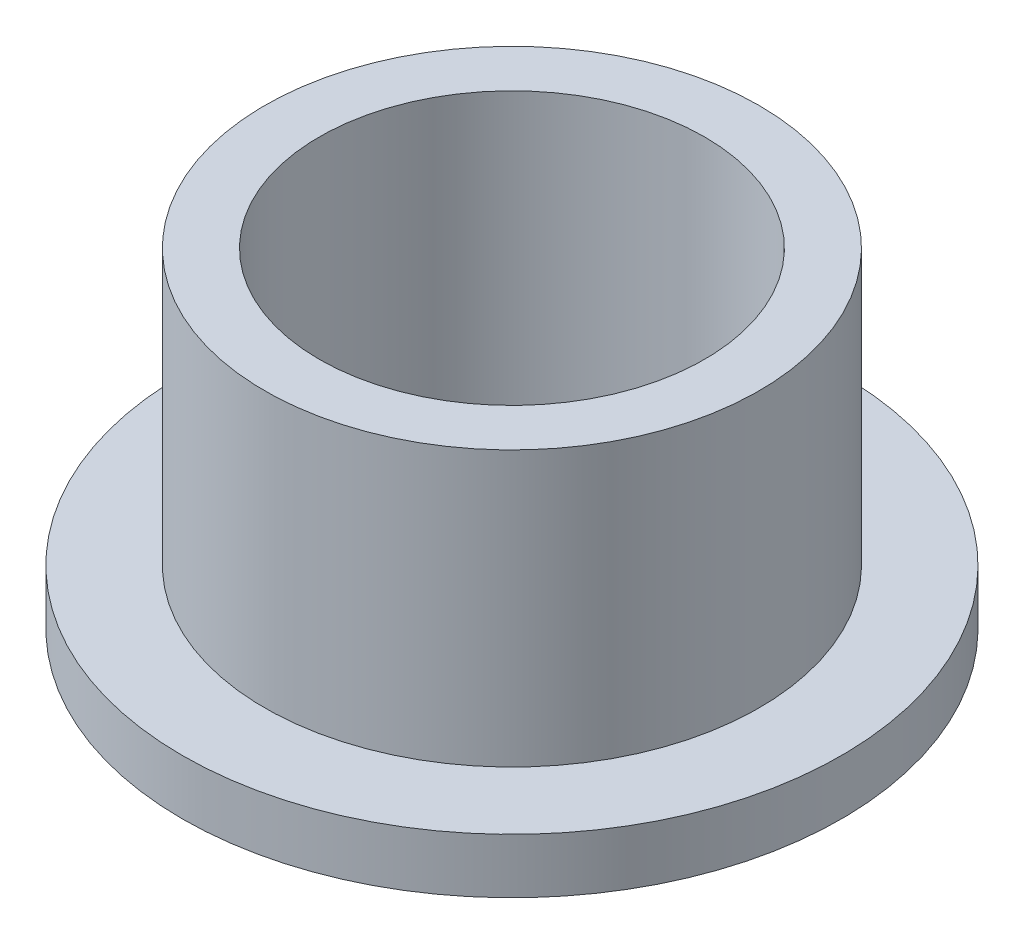
ISO-10303-21;
HEADER;
FILE_DESCRIPTION(('STEP AP214'),'2;1');
FILE_NAME('part.step','',(''),(''),'','','');
FILE_SCHEMA(('AUTOMOTIVE_DESIGN { 1 0 10303 214 1 1 1 1 }'));
ENDSEC;
DATA;
#1=APPLICATION_CONTEXT('core data for automotive mechanical design processes');
#2=APPLICATION_PROTOCOL_DEFINITION('international standard','automotive_design',2000,#1);
#3=PRODUCT_CONTEXT('',#1,'mechanical');
#4=PRODUCT('Part','Part','',(#3));
#5=PRODUCT_RELATED_PRODUCT_CATEGORY('part','',(#4));
#6=PRODUCT_DEFINITION_FORMATION('','',#4);
#7=PRODUCT_DEFINITION_CONTEXT('part definition',#1,'design');
#8=PRODUCT_DEFINITION('design','',#6,#7);
#9=PRODUCT_DEFINITION_SHAPE('','',#8);
#10=(LENGTH_UNIT() NAMED_UNIT(*) SI_UNIT(.MILLI.,.METRE.));
#11=(NAMED_UNIT(*) PLANE_ANGLE_UNIT() SI_UNIT($,.RADIAN.));
#12=(NAMED_UNIT(*) SI_UNIT($,.STERADIAN.) SOLID_ANGLE_UNIT());
#13=UNCERTAINTY_MEASURE_WITH_UNIT(LENGTH_MEASURE(1.E-05),#10,'distance_accuracy_value','');
#14=(GEOMETRIC_REPRESENTATION_CONTEXT(3) GLOBAL_UNCERTAINTY_ASSIGNED_CONTEXT((#13)) GLOBAL_UNIT_ASSIGNED_CONTEXT((#10,
#11,#12)) REPRESENTATION_CONTEXT('',''));
#15=CARTESIAN_POINT('',(0.,0.,0.));
#16=DIRECTION('',(0.,0.,1.));
#17=DIRECTION('',(1.,0.,0.));
#18=AXIS2_PLACEMENT_3D('',#15,#16,#17);
#19=CARTESIAN_POINT('',(0.,19.05,0.));
#20=DIRECTION('',(0.,1.,0.));
#21=DIRECTION('',(0.,0.,1.));
#22=AXIS2_PLACEMENT_3D('',#19,#20,#21);
#23=PLANE('',#22);
#24=CARTESIAN_POINT('',(0.,19.05,0.));
#25=DIRECTION('',(0.,1.,0.));
#26=DIRECTION('',(0.,0.,1.));
#27=AXIS2_PLACEMENT_3D('',#24,#25,#26);
#28=CIRCLE('',#27,14.2875);
#29=CARTESIAN_POINT('',(0.,19.05,-14.2875));
#30=VERTEX_POINT('',#29);
#31=EDGE_CURVE('E10',#30,#30,#28,.T.);
#32=ORIENTED_EDGE('',*,*,#31,.T.);
#33=EDGE_LOOP('',(#32));
#34=FACE_BOUND('',#33,.T.);
#35=CARTESIAN_POINT('',(0.,19.05,0.));
#36=DIRECTION('',(0.,1.,0.));
#37=DIRECTION('',(0.,0.,1.));
#38=AXIS2_PLACEMENT_3D('',#35,#36,#37);
#39=CIRCLE('',#38,11.1379);
#40=CARTESIAN_POINT('',(0.,19.05,-11.1379));
#41=VERTEX_POINT('',#40);
#42=EDGE_CURVE('E39',#41,#41,#39,.T.);
#43=ORIENTED_EDGE('',*,*,#42,.F.);
#44=EDGE_LOOP('',(#43));
#45=FACE_BOUND('',#44,.T.);
#46=ADVANCED_FACE('F32',(#34,#45),#23,.T.);
#47=CARTESIAN_POINT('',(0.,0.,0.));
#48=DIRECTION('',(0.,1.,0.));
#49=DIRECTION('',(0.,0.,1.));
#50=AXIS2_PLACEMENT_3D('',#47,#48,#49);
#51=PLANE('',#50);
#52=CARTESIAN_POINT('',(0.,0.,0.));
#53=DIRECTION('',(0.,1.,0.));
#54=DIRECTION('',(0.,0.,1.));
#55=AXIS2_PLACEMENT_3D('',#52,#53,#54);
#56=CIRCLE('',#55,11.1379);
#57=CARTESIAN_POINT('',(0.,0.,-11.1379));
#58=VERTEX_POINT('',#57);
#59=EDGE_CURVE('E43',#58,#58,#56,.T.);
#60=ORIENTED_EDGE('',*,*,#59,.T.);
#61=EDGE_LOOP('',(#60));
#62=FACE_BOUND('',#61,.T.);
#63=CARTESIAN_POINT('',(0.,0.,0.));
#64=DIRECTION('',(0.,1.,0.));
#65=DIRECTION('',(0.,0.,1.));
#66=AXIS2_PLACEMENT_3D('',#63,#64,#65);
#67=CIRCLE('',#66,19.05);
#68=CARTESIAN_POINT('',(0.,0.,19.05));
#69=VERTEX_POINT('',#68);
#70=EDGE_CURVE('E50',#69,#69,#67,.T.);
#71=ORIENTED_EDGE('',*,*,#70,.F.);
#72=EDGE_LOOP('',(#71));
#73=FACE_BOUND('',#72,.T.);
#74=ADVANCED_FACE('F75',(#62,#73),#51,.F.);
#75=CARTESIAN_POINT('',(0.,19.05,0.));
#76=DIRECTION('',(0.,-1.,0.));
#77=DIRECTION('',(0.,0.,-1.));
#78=AXIS2_PLACEMENT_3D('',#75,#76,#77);
#79=CYLINDRICAL_SURFACE('',#78,14.2875);
#80=CARTESIAN_POINT('',(0.,3.175,0.));
#81=DIRECTION('',(0.,1.,0.));
#82=DIRECTION('',(0.,0.,1.));
#83=AXIS2_PLACEMENT_3D('',#80,#81,#82);
#84=CIRCLE('',#83,14.2875);
#85=CARTESIAN_POINT('',(0.,3.175,-14.2875));
#86=VERTEX_POINT('',#85);
#87=EDGE_CURVE('E53',#86,#86,#84,.T.);
#88=CARTESIAN_POINT('',(0.,3.175,-14.2875));
#89=CARTESIAN_POINT('',(0.,3.34036458333333,-14.2875));
#90=CARTESIAN_POINT('',(0.,3.50572916666666,-14.2875));
#91=CARTESIAN_POINT('',(0.,3.83645833333333,-14.2875));
#92=CARTESIAN_POINT('',(0.,4.00182291666666,-14.2875));
#93=CARTESIAN_POINT('',(0.,4.33255208333333,-14.2875));
#94=CARTESIAN_POINT('',(0.,4.49791666666666,-14.2875));
#95=CARTESIAN_POINT('',(0.,4.82864583333333,-14.2875));
#96=CARTESIAN_POINT('',(0.,4.99401041666666,-14.2875));
#97=CARTESIAN_POINT('',(0.,5.32473958333333,-14.2875));
#98=CARTESIAN_POINT('',(0.,5.49010416666666,-14.2875));
#99=CARTESIAN_POINT('',(0.,5.82083333333333,-14.2875));
#100=CARTESIAN_POINT('',(0.,5.98619791666666,-14.2875));
#101=CARTESIAN_POINT('',(0.,6.31692708333333,-14.2875));
#102=CARTESIAN_POINT('',(0.,6.48229166666666,-14.2875));
#103=CARTESIAN_POINT('',(0.,6.81302083333333,-14.2875));
#104=CARTESIAN_POINT('',(0.,6.97838541666666,-14.2875));
#105=CARTESIAN_POINT('',(0.,7.30911458333333,-14.2875));
#106=CARTESIAN_POINT('',(0.,7.47447916666667,-14.2875));
#107=CARTESIAN_POINT('',(0.,7.80520833333333,-14.2875));
#108=CARTESIAN_POINT('',(0.,7.97057291666667,-14.2875));
#109=CARTESIAN_POINT('',(0.,8.30130208333333,-14.2875));
#110=CARTESIAN_POINT('',(0.,8.46666666666666,-14.2875));
#111=CARTESIAN_POINT('',(0.,8.79739583333333,-14.2875));
#112=CARTESIAN_POINT('',(0.,8.96276041666667,-14.2875));
#113=CARTESIAN_POINT('',(0.,9.29348958333333,-14.2875));
#114=CARTESIAN_POINT('',(0.,9.45885416666667,-14.2875));
#115=CARTESIAN_POINT('',(0.,9.78958333333333,-14.2875));
#116=CARTESIAN_POINT('',(0.,9.95494791666667,-14.2875));
#117=CARTESIAN_POINT('',(0.,10.2856770833333,-14.2875));
#118=CARTESIAN_POINT('',(0.,10.4510416666667,-14.2875));
#119=CARTESIAN_POINT('',(0.,10.7817708333333,-14.2875));
#120=CARTESIAN_POINT('',(0.,10.9471354166667,-14.2875));
#121=CARTESIAN_POINT('',(0.,11.2778645833333,-14.2875));
#122=CARTESIAN_POINT('',(0.,11.4432291666667,-14.2875));
#123=CARTESIAN_POINT('',(0.,11.7739583333333,-14.2875));
#124=CARTESIAN_POINT('',(0.,11.9393229166667,-14.2875));
#125=CARTESIAN_POINT('',(0.,12.2700520833333,-14.2875));
#126=CARTESIAN_POINT('',(0.,12.4354166666667,-14.2875));
#127=CARTESIAN_POINT('',(0.,12.7661458333333,-14.2875));
#128=CARTESIAN_POINT('',(0.,12.9315104166667,-14.2875));
#129=CARTESIAN_POINT('',(0.,13.2622395833333,-14.2875));
#130=CARTESIAN_POINT('',(0.,13.4276041666667,-14.2875));
#131=CARTESIAN_POINT('',(0.,13.7583333333333,-14.2875));
#132=CARTESIAN_POINT('',(0.,13.9236979166667,-14.2875));
#133=CARTESIAN_POINT('',(0.,14.2544270833333,-14.2875));
#134=CARTESIAN_POINT('',(0.,14.4197916666667,-14.2875));
#135=CARTESIAN_POINT('',(0.,14.7505208333333,-14.2875));
#136=CARTESIAN_POINT('',(0.,14.9158854166667,-14.2875));
#137=CARTESIAN_POINT('',(0.,15.2466145833333,-14.2875));
#138=CARTESIAN_POINT('',(0.,15.4119791666667,-14.2875));
#139=CARTESIAN_POINT('',(0.,15.7427083333333,-14.2875));
#140=CARTESIAN_POINT('',(0.,15.9080729166667,-14.2875));
#141=CARTESIAN_POINT('',(0.,16.2388020833333,-14.2875));
#142=CARTESIAN_POINT('',(0.,16.4041666666667,-14.2875));
#143=CARTESIAN_POINT('',(0.,16.7348958333333,-14.2875));
#144=CARTESIAN_POINT('',(0.,16.9002604166667,-14.2875));
#145=CARTESIAN_POINT('',(0.,17.2309895833333,-14.2875));
#146=CARTESIAN_POINT('',(0.,17.3963541666667,-14.2875));
#147=CARTESIAN_POINT('',(0.,17.7270833333333,-14.2875));
#148=CARTESIAN_POINT('',(0.,17.8924479166667,-14.2875));
#149=CARTESIAN_POINT('',(0.,18.2231770833333,-14.2875));
#150=CARTESIAN_POINT('',(0.,18.3885416666667,-14.2875));
#151=CARTESIAN_POINT('',(0.,18.7192708333333,-14.2875));
#152=CARTESIAN_POINT('',(0.,18.8846354166667,-14.2875));
#153=CARTESIAN_POINT('',(0.,19.05,-14.2875));
#154=B_SPLINE_CURVE_WITH_KNOTS('',3,(#88,#89,#90,#91,#92,#93,#94,#95,#96,#97,#98,#99,#100,#101,
#102,#103,#104,#105,#106,#107,#108,#109,#110,#111,#112,#113,#114,#115,#116,#117,#118,#119,#120,
#121,#122,#123,#124,#125,#126,#127,#128,#129,#130,#131,#132,#133,#134,#135,#136,#137,#138,#139,
#140,#141,#142,#143,#144,#145,#146,#147,#148,#149,#150,#151,#152,#153),.UNSPECIFIED.,.F.,.F.,(4,
2,2,2,2,2,2,2,2,2,2,2,2,2,2,2,2,2,2,2,2,2,2,2,2,2,2,2,2,2,2,2,4),(0.,0.496093749999999,
0.992187499999998,1.48828125,1.984375,2.48046875,2.9765625,3.47265625,3.96875,4.46484375,
4.9609375,5.45703125,5.953125,6.44921875,6.9453125,7.44140625,7.9375,8.43359375,8.9296875,
9.42578125,9.921875,10.41796875,10.9140625,11.41015625,11.90625,12.40234375,12.8984375,
13.39453125,13.890625,14.38671875,14.8828125,15.37890625,15.875),.UNSPECIFIED.);
#155=EDGE_CURVE('BSEAM34',#86,#30,#154,.T.);
#156=ORIENTED_EDGE('',*,*,#87,.T.);
#157=ORIENTED_EDGE('',*,*,#31,.F.);
#158=ORIENTED_EDGE('',*,*,#155,.T.);
#159=ORIENTED_EDGE('',*,*,#155,.F.);
#160=EDGE_LOOP('',(#156,#158,#157,#159));
#161=FACE_BOUND('',#160,.T.);
#162=ADVANCED_FACE('F34',(#161),#79,.T.);
#163=CARTESIAN_POINT('',(0.,19.05,0.));
#164=DIRECTION('',(0.,-1.,0.));
#165=DIRECTION('',(0.,0.,-1.));
#166=AXIS2_PLACEMENT_3D('',#163,#164,#165);
#167=CYLINDRICAL_SURFACE('',#166,11.1379);
#168=CARTESIAN_POINT('',(0.,19.05,-11.1379));
#169=CARTESIAN_POINT('',(0.,18.8515625,-11.1379));
#170=CARTESIAN_POINT('',(0.,18.653125,-11.1379));
#171=CARTESIAN_POINT('',(0.,18.25625,-11.1379));
#172=CARTESIAN_POINT('',(0.,18.0578125,-11.1379));
#173=CARTESIAN_POINT('',(0.,17.6609375,-11.1379));
#174=CARTESIAN_POINT('',(0.,17.4625,-11.1379));
#175=CARTESIAN_POINT('',(0.,17.065625,-11.1379));
#176=CARTESIAN_POINT('',(0.,16.8671875,-11.1379));
#177=CARTESIAN_POINT('',(0.,16.4703125,-11.1379));
#178=CARTESIAN_POINT('',(0.,16.271875,-11.1379));
#179=CARTESIAN_POINT('',(0.,15.875,-11.1379));
#180=CARTESIAN_POINT('',(0.,15.6765625,-11.1379));
#181=CARTESIAN_POINT('',(0.,15.2796875,-11.1379));
#182=CARTESIAN_POINT('',(0.,15.08125,-11.1379));
#183=CARTESIAN_POINT('',(0.,14.684375,-11.1379));
#184=CARTESIAN_POINT('',(0.,14.4859375,-11.1379));
#185=CARTESIAN_POINT('',(0.,14.0890625,-11.1379));
#186=CARTESIAN_POINT('',(0.,13.890625,-11.1379));
#187=CARTESIAN_POINT('',(0.,13.49375,-11.1379));
#188=CARTESIAN_POINT('',(0.,13.2953125,-11.1379));
#189=CARTESIAN_POINT('',(0.,12.8984375,-11.1379));
#190=CARTESIAN_POINT('',(0.,12.7,-11.1379));
#191=CARTESIAN_POINT('',(0.,12.303125,-11.1379));
#192=CARTESIAN_POINT('',(0.,12.1046875,-11.1379));
#193=CARTESIAN_POINT('',(0.,11.7078125,-11.1379));
#194=CARTESIAN_POINT('',(0.,11.509375,-11.1379));
#195=CARTESIAN_POINT('',(0.,11.1125,-11.1379));
#196=CARTESIAN_POINT('',(0.,10.9140625,-11.1379));
#197=CARTESIAN_POINT('',(0.,10.5171875,-11.1379));
#198=CARTESIAN_POINT('',(0.,10.31875,-11.1379));
#199=CARTESIAN_POINT('',(0.,9.921875,-11.1379));
#200=CARTESIAN_POINT('',(0.,9.7234375,-11.1379));
#201=CARTESIAN_POINT('',(0.,9.3265625,-11.1379));
#202=CARTESIAN_POINT('',(0.,9.128125,-11.1379));
#203=CARTESIAN_POINT('',(0.,8.73125,-11.1379));
#204=CARTESIAN_POINT('',(0.,8.5328125,-11.1379));
#205=CARTESIAN_POINT('',(0.,8.1359375,-11.1379));
#206=CARTESIAN_POINT('',(0.,7.9375,-11.1379));
#207=CARTESIAN_POINT('',(0.,7.540625,-11.1379));
#208=CARTESIAN_POINT('',(0.,7.3421875,-11.1379));
#209=CARTESIAN_POINT('',(0.,6.9453125,-11.1379));
#210=CARTESIAN_POINT('',(0.,6.746875,-11.1379));
#211=CARTESIAN_POINT('',(0.,6.35,-11.1379));
#212=CARTESIAN_POINT('',(0.,6.1515625,-11.1379));
#213=CARTESIAN_POINT('',(0.,5.7546875,-11.1379));
#214=CARTESIAN_POINT('',(0.,5.55625,-11.1379));
#215=CARTESIAN_POINT('',(0.,5.159375,-11.1379));
#216=CARTESIAN_POINT('',(0.,4.9609375,-11.1379));
#217=CARTESIAN_POINT('',(0.,4.5640625,-11.1379));
#218=CARTESIAN_POINT('',(0.,4.365625,-11.1379));
#219=CARTESIAN_POINT('',(0.,3.96875,-11.1379));
#220=CARTESIAN_POINT('',(0.,3.7703125,-11.1379));
#221=CARTESIAN_POINT('',(0.,3.3734375,-11.1379));
#222=CARTESIAN_POINT('',(0.,3.175,-11.1379));
#223=CARTESIAN_POINT('',(0.,2.778125,-11.1379));
#224=CARTESIAN_POINT('',(0.,2.5796875,-11.1379));
#225=CARTESIAN_POINT('',(0.,2.1828125,-11.1379));
#226=CARTESIAN_POINT('',(0.,1.984375,-11.1379));
#227=CARTESIAN_POINT('',(0.,1.5875,-11.1379));
#228=CARTESIAN_POINT('',(0.,1.3890625,-11.1379));
#229=CARTESIAN_POINT('',(0.,0.992187500000001,-11.1379));
#230=CARTESIAN_POINT('',(0.,0.793750000000001,-11.1379));
#231=CARTESIAN_POINT('',(0.,0.396875,-11.1379));
#232=CARTESIAN_POINT('',(0.,0.1984375,-11.1379));
#233=CARTESIAN_POINT('',(0.,0.,-11.1379));
#234=B_SPLINE_CURVE_WITH_KNOTS('',3,(#168,#169,#170,#171,#172,#173,#174,#175,#176,#177,#178,
#179,#180,#181,#182,#183,#184,#185,#186,#187,#188,#189,#190,#191,#192,#193,#194,#195,#196,#197,
#198,#199,#200,#201,#202,#203,#204,#205,#206,#207,#208,#209,#210,#211,#212,#213,#214,#215,#216,
#217,#218,#219,#220,#221,#222,#223,#224,#225,#226,#227,#228,#229,#230,#231,#232,#233),
.UNSPECIFIED.,.F.,.F.,(4,2,2,2,2,2,2,2,2,2,2,2,2,2,2,2,2,2,2,2,2,2,2,2,2,2,2,2,2,2,2,2,4),(0.,
0.5953125,1.190625,1.7859375,2.38125,2.9765625,3.571875,4.1671875,4.7625,5.3578125,5.953125,
6.5484375,7.14375,7.7390625,8.334375,8.9296875,9.525,10.1203125,10.715625,11.3109375,11.90625,
12.5015625,13.096875,13.6921875,14.2875,14.8828125,15.478125,16.0734375,16.66875,17.2640625,
17.859375,18.4546875,19.05),.UNSPECIFIED.);
#235=EDGE_CURVE('BSEAM64',#41,#58,#234,.T.);
#236=ORIENTED_EDGE('',*,*,#42,.T.);
#237=ORIENTED_EDGE('',*,*,#59,.F.);
#238=ORIENTED_EDGE('',*,*,#235,.T.);
#239=ORIENTED_EDGE('',*,*,#235,.F.);
#240=EDGE_LOOP('',(#236,#238,#237,#239));
#241=FACE_BOUND('',#240,.T.);
#242=ADVANCED_FACE('F64',(#241),#167,.F.);
#243=CARTESIAN_POINT('',(0.,3.175,0.));
#244=DIRECTION('',(0.,1.,0.));
#245=DIRECTION('',(0.,0.,1.));
#246=AXIS2_PLACEMENT_3D('',#243,#244,#245);
#247=PLANE('',#246);
#248=CARTESIAN_POINT('',(0.,3.175,0.));
#249=DIRECTION('',(0.,1.,0.));
#250=DIRECTION('',(0.,0.,1.));
#251=AXIS2_PLACEMENT_3D('',#248,#249,#250);
#252=CIRCLE('',#251,19.05);
#253=CARTESIAN_POINT('',(0.,3.175,19.05));
#254=VERTEX_POINT('',#253);
#255=EDGE_CURVE('E48',#254,#254,#252,.T.);
#256=ORIENTED_EDGE('',*,*,#255,.T.);
#257=EDGE_LOOP('',(#256));
#258=FACE_BOUND('',#257,.T.);
#259=ORIENTED_EDGE('',*,*,#87,.F.);
#260=EDGE_LOOP('',(#259));
#261=FACE_BOUND('',#260,.T.);
#262=ADVANCED_FACE('F61',(#258,#261),#247,.T.);
#263=CARTESIAN_POINT('',(0.,3.175,0.));
#264=DIRECTION('',(0.,-1.,0.));
#265=DIRECTION('',(0.,0.,-1.));
#266=AXIS2_PLACEMENT_3D('',#263,#264,#265);
#267=CYLINDRICAL_SURFACE('',#266,19.05);
#268=ORIENTED_EDGE('',*,*,#255,.F.);
#269=EDGE_LOOP('',(#268));
#270=FACE_BOUND('',#269,.T.);
#271=ORIENTED_EDGE('',*,*,#70,.T.);
#272=EDGE_LOOP('',(#271));
#273=FACE_BOUND('',#272,.T.);
#274=ADVANCED_FACE('F63',(#270,#273),#267,.T.);
#275=CLOSED_SHELL('',(#46,#74,#162,#242,#262,#274));
#276=MANIFOLD_SOLID_BREP('B2',#275);
#277=ADVANCED_BREP_SHAPE_REPRESENTATION('',(#18,#276),#14);
#278=SHAPE_DEFINITION_REPRESENTATION(#9,#277);
ENDSEC;
END-ISO-10303-21;
